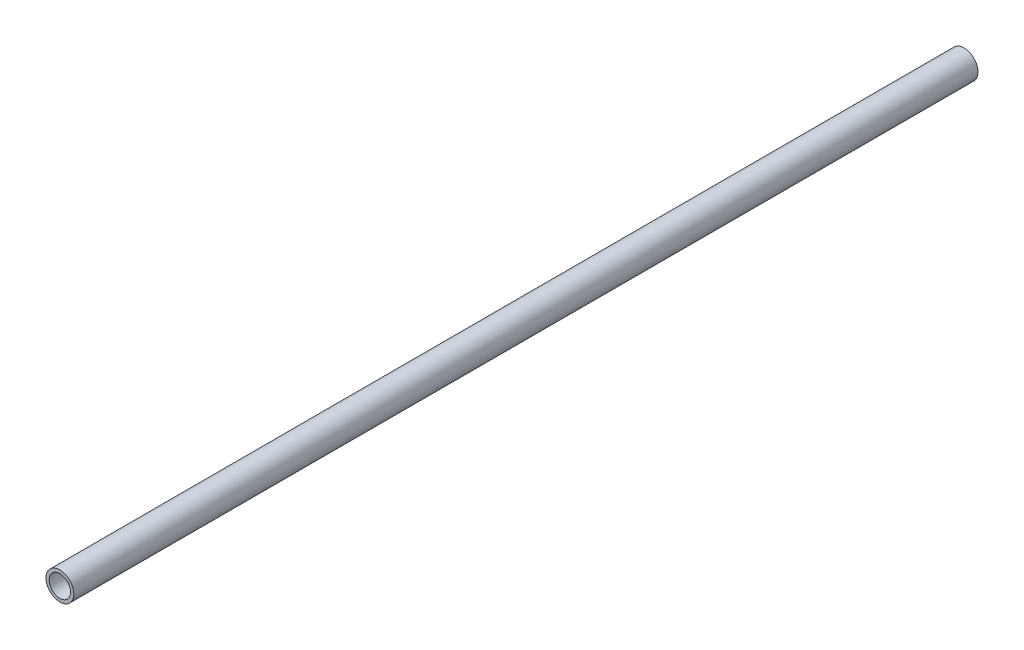
ISO-10303-21;
HEADER;
FILE_DESCRIPTION(('STEP AP214'),'2;1');
FILE_NAME('part.step','',(''),(''),'','','');
FILE_SCHEMA(('AUTOMOTIVE_DESIGN { 1 0 10303 214 1 1 1 1 }'));
ENDSEC;
DATA;
#1=APPLICATION_CONTEXT('core data for automotive mechanical design processes');
#2=APPLICATION_PROTOCOL_DEFINITION('international standard','automotive_design',2000,#1);
#3=PRODUCT_CONTEXT('',#1,'mechanical');
#4=PRODUCT('Part','Part','',(#3));
#5=PRODUCT_RELATED_PRODUCT_CATEGORY('part','',(#4));
#6=PRODUCT_DEFINITION_FORMATION('','',#4);
#7=PRODUCT_DEFINITION_CONTEXT('part definition',#1,'design');
#8=PRODUCT_DEFINITION('design','',#6,#7);
#9=PRODUCT_DEFINITION_SHAPE('','',#8);
#10=(LENGTH_UNIT() NAMED_UNIT(*) SI_UNIT(.MILLI.,.METRE.));
#11=(NAMED_UNIT(*) PLANE_ANGLE_UNIT() SI_UNIT($,.RADIAN.));
#12=(NAMED_UNIT(*) SI_UNIT($,.STERADIAN.) SOLID_ANGLE_UNIT());
#13=UNCERTAINTY_MEASURE_WITH_UNIT(LENGTH_MEASURE(1.E-05),#10,'distance_accuracy_value','');
#14=(GEOMETRIC_REPRESENTATION_CONTEXT(3) GLOBAL_UNCERTAINTY_ASSIGNED_CONTEXT((#13)) GLOBAL_UNIT_ASSIGNED_CONTEXT((#10,
#11,#12)) REPRESENTATION_CONTEXT('',''));
#15=CARTESIAN_POINT('',(0.,0.,0.));
#16=DIRECTION('',(0.,0.,1.));
#17=DIRECTION('',(1.,0.,0.));
#18=AXIS2_PLACEMENT_3D('',#15,#16,#17);
#19=CARTESIAN_POINT('',(0.,0.,206.375));
#20=DIRECTION('',(0.,0.,1.));
#21=DIRECTION('',(1.,0.,0.));
#22=AXIS2_PLACEMENT_3D('',#19,#20,#21);
#23=PLANE('',#22);
#24=CARTESIAN_POINT('',(0.,0.,206.375));
#25=DIRECTION('',(0.,0.,1.));
#26=DIRECTION('',(1.,0.,0.));
#27=AXIS2_PLACEMENT_3D('',#24,#25,#26);
#28=CIRCLE('',#27,6.35);
#29=CARTESIAN_POINT('',(6.35,0.,206.375));
#30=VERTEX_POINT('',#29);
#31=EDGE_CURVE('E10',#30,#30,#28,.T.);
#32=ORIENTED_EDGE('',*,*,#31,.T.);
#33=EDGE_LOOP('',(#32));
#34=FACE_BOUND('',#33,.T.);
#35=CARTESIAN_POINT('',(0.,0.,206.375));
#36=DIRECTION('',(0.,0.,1.));
#37=DIRECTION('',(1.,0.,0.));
#38=AXIS2_PLACEMENT_3D('',#35,#36,#37);
#39=CIRCLE('',#38,4.8768);
#40=CARTESIAN_POINT('',(4.8768,0.,206.375));
#41=VERTEX_POINT('',#40);
#42=EDGE_CURVE('E50',#41,#41,#39,.T.);
#43=ORIENTED_EDGE('',*,*,#42,.F.);
#44=EDGE_LOOP('',(#43));
#45=FACE_BOUND('',#44,.T.);
#46=ADVANCED_FACE('F39',(#34,#45),#23,.T.);
#47=CARTESIAN_POINT('',(0.,0.,-206.375));
#48=DIRECTION('',(0.,0.,1.));
#49=DIRECTION('',(1.,0.,0.));
#50=AXIS2_PLACEMENT_3D('',#47,#48,#49);
#51=PLANE('',#50);
#52=CARTESIAN_POINT('',(0.,0.,-206.375));
#53=DIRECTION('',(0.,0.,1.));
#54=DIRECTION('',(1.,0.,0.));
#55=AXIS2_PLACEMENT_3D('',#52,#53,#54);
#56=CIRCLE('',#55,6.35);
#57=CARTESIAN_POINT('',(6.35,0.,-206.375));
#58=VERTEX_POINT('',#57);
#59=EDGE_CURVE('E43',#58,#58,#56,.T.);
#60=ORIENTED_EDGE('',*,*,#59,.F.);
#61=EDGE_LOOP('',(#60));
#62=FACE_BOUND('',#61,.T.);
#63=CARTESIAN_POINT('',(0.,0.,-206.375));
#64=DIRECTION('',(0.,0.,1.));
#65=DIRECTION('',(1.,0.,0.));
#66=AXIS2_PLACEMENT_3D('',#63,#64,#65);
#67=CIRCLE('',#66,4.8768);
#68=CARTESIAN_POINT('',(4.8768,0.,-206.375));
#69=VERTEX_POINT('',#68);
#70=EDGE_CURVE('E52',#69,#69,#67,.T.);
#71=ORIENTED_EDGE('',*,*,#70,.T.);
#72=EDGE_LOOP('',(#71));
#73=FACE_BOUND('',#72,.T.);
#74=ADVANCED_FACE('F62',(#62,#73),#51,.F.);
#75=CARTESIAN_POINT('',(0.,0.,206.375));
#76=DIRECTION('',(0.,0.,-1.));
#77=DIRECTION('',(-1.,0.,0.));
#78=AXIS2_PLACEMENT_3D('',#75,#76,#77);
#79=CYLINDRICAL_SURFACE('',#78,6.35);
#80=ORIENTED_EDGE('',*,*,#31,.F.);
#81=EDGE_LOOP('',(#80));
#82=FACE_BOUND('',#81,.T.);
#83=ORIENTED_EDGE('',*,*,#59,.T.);
#84=EDGE_LOOP('',(#83));
#85=FACE_BOUND('',#84,.T.);
#86=ADVANCED_FACE('F41',(#82,#85),#79,.T.);
#87=CARTESIAN_POINT('',(0.,0.,206.375));
#88=DIRECTION('',(0.,0.,-1.));
#89=DIRECTION('',(-1.,0.,0.));
#90=AXIS2_PLACEMENT_3D('',#87,#88,#89);
#91=CYLINDRICAL_SURFACE('',#90,4.8768);
#92=ORIENTED_EDGE('',*,*,#42,.T.);
#93=EDGE_LOOP('',(#92));
#94=FACE_BOUND('',#93,.T.);
#95=ORIENTED_EDGE('',*,*,#70,.F.);
#96=EDGE_LOOP('',(#95));
#97=FACE_BOUND('',#96,.T.);
#98=ADVANCED_FACE('F58',(#94,#97),#91,.F.);
#99=CLOSED_SHELL('',(#46,#74,#86,#98));
#100=MANIFOLD_SOLID_BREP('B2',#99);
#101=ADVANCED_BREP_SHAPE_REPRESENTATION('',(#18,#100),#14);
#102=SHAPE_DEFINITION_REPRESENTATION(#9,#101);
ENDSEC;
END-ISO-10303-21;
